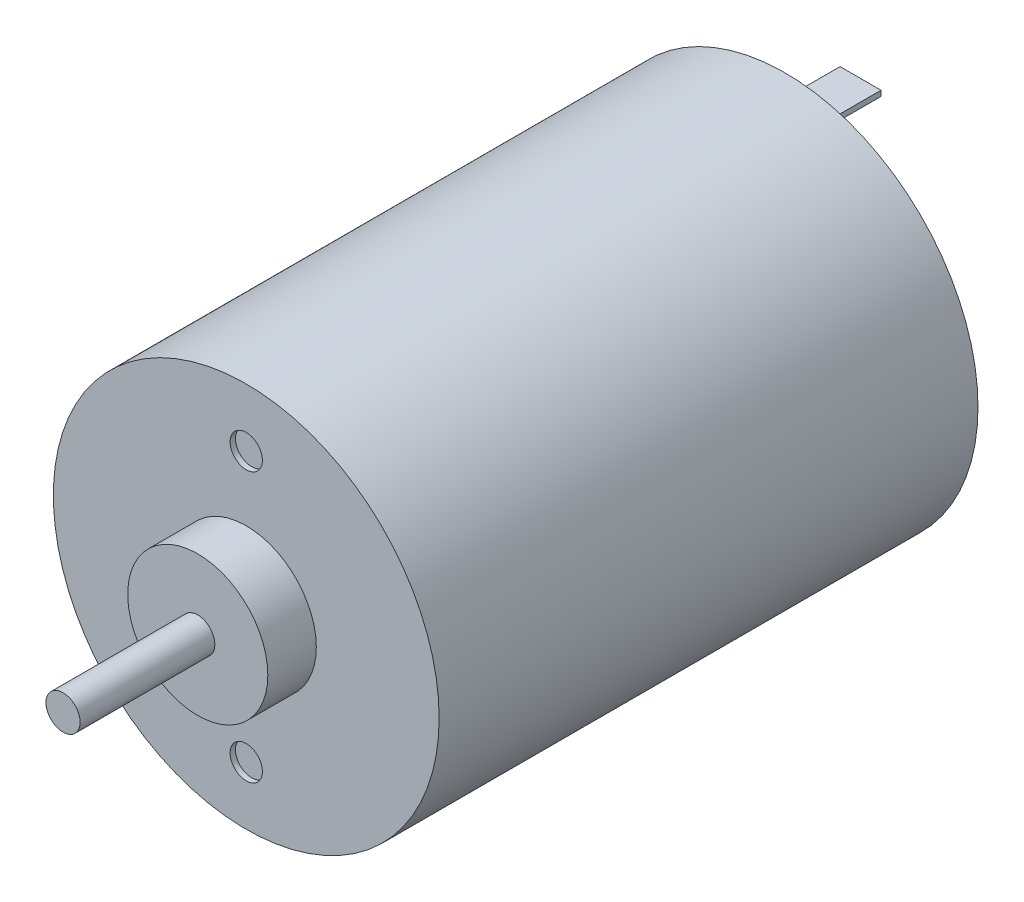
ISO-10303-21;
HEADER;
FILE_DESCRIPTION(('STEP AP214'),'2;1');
FILE_NAME('part.step','',(''),(''),'','','');
FILE_SCHEMA(('AUTOMOTIVE_DESIGN { 1 0 10303 214 1 1 1 1 }'));
ENDSEC;
DATA;
#1=APPLICATION_CONTEXT('core data for automotive mechanical design processes');
#2=APPLICATION_PROTOCOL_DEFINITION('international standard','automotive_design',2000,#1);
#3=PRODUCT_CONTEXT('',#1,'mechanical');
#4=PRODUCT('Part','Part','',(#3));
#5=PRODUCT_RELATED_PRODUCT_CATEGORY('part','',(#4));
#6=PRODUCT_DEFINITION_FORMATION('','',#4);
#7=PRODUCT_DEFINITION_CONTEXT('part definition',#1,'design');
#8=PRODUCT_DEFINITION('design','',#6,#7);
#9=PRODUCT_DEFINITION_SHAPE('','',#8);
#10=(LENGTH_UNIT() NAMED_UNIT(*) SI_UNIT(.MILLI.,.METRE.));
#11=(NAMED_UNIT(*) PLANE_ANGLE_UNIT() SI_UNIT($,.RADIAN.));
#12=(NAMED_UNIT(*) SI_UNIT($,.STERADIAN.) SOLID_ANGLE_UNIT());
#13=UNCERTAINTY_MEASURE_WITH_UNIT(LENGTH_MEASURE(1.E-05),#10,'distance_accuracy_value','');
#14=(GEOMETRIC_REPRESENTATION_CONTEXT(3) GLOBAL_UNCERTAINTY_ASSIGNED_CONTEXT((#13)) GLOBAL_UNIT_ASSIGNED_CONTEXT((#10,
#11,#12)) REPRESENTATION_CONTEXT('',''));
#15=CARTESIAN_POINT('',(0.,0.,0.));
#16=DIRECTION('',(0.,0.,1.));
#17=DIRECTION('',(1.,0.,0.));
#18=AXIS2_PLACEMENT_3D('',#15,#16,#17);
#19=CARTESIAN_POINT('',(0.,0.,0.));
#20=DIRECTION('',(0.,0.,1.));
#21=DIRECTION('',(1.,0.,0.));
#22=AXIS2_PLACEMENT_3D('',#19,#20,#21);
#23=PLANE('',#22);
#24=DIRECTION('',(0.,-1.,0.));
#25=VECTOR('',#24,1.);
#26=CARTESIAN_POINT('',(1.9,13.95,0.));
#27=LINE('',#26,#25);
#28=CARTESIAN_POINT('',(1.9,13.95,0.));
#29=VERTEX_POINT('',#28);
#30=CARTESIAN_POINT('',(1.9,13.45,0.));
#31=VERTEX_POINT('',#30);
#32=EDGE_CURVE('E121',#29,#31,#27,.T.);
#33=ORIENTED_EDGE('',*,*,#32,.F.);
#34=DIRECTION('',(1.,0.,0.));
#35=VECTOR('',#34,1.);
#36=CARTESIAN_POINT('',(1.9,13.95,0.));
#37=LINE('',#36,#35);
#38=CARTESIAN_POINT('',(-1.9,13.95,0.));
#39=VERTEX_POINT('',#38);
#40=EDGE_CURVE('E134',#39,#29,#37,.T.);
#41=ORIENTED_EDGE('',*,*,#40,.F.);
#42=DIRECTION('',(0.,1.,0.));
#43=VECTOR('',#42,1.);
#44=CARTESIAN_POINT('',(-1.9,13.95,0.));
#45=LINE('',#44,#43);
#46=CARTESIAN_POINT('',(-1.9,13.45,0.));
#47=VERTEX_POINT('',#46);
#48=EDGE_CURVE('E143',#47,#39,#45,.T.);
#49=ORIENTED_EDGE('',*,*,#48,.F.);
#50=DIRECTION('',(-1.,0.,0.));
#51=VECTOR('',#50,1.);
#52=CARTESIAN_POINT('',(1.9,13.45,0.));
#53=LINE('',#52,#51);
#54=EDGE_CURVE('E124',#31,#47,#53,.T.);
#55=ORIENTED_EDGE('',*,*,#54,.F.);
#56=EDGE_LOOP('',(#33,#41,#49,#55));
#57=FACE_BOUND('',#56,.T.);
#58=CARTESIAN_POINT('',(0.,0.,0.));
#59=DIRECTION('',(0.,0.,1.));
#60=DIRECTION('',(1.,0.,0.));
#61=AXIS2_PLACEMENT_3D('',#58,#59,#60);
#62=CIRCLE('',#61,17.9);
#63=CARTESIAN_POINT('',(17.9,0.,0.));
#64=VERTEX_POINT('',#63);
#65=EDGE_CURVE('E37',#64,#64,#62,.T.);
#66=ORIENTED_EDGE('',*,*,#65,.F.);
#67=EDGE_LOOP('',(#66));
#68=FACE_BOUND('',#67,.T.);
#69=DIRECTION('',(0.,-1.,0.));
#70=VECTOR('',#69,1.);
#71=CARTESIAN_POINT('',(1.9,-13.95,0.));
#72=LINE('',#71,#70);
#73=CARTESIAN_POINT('',(1.9,-13.45,0.));
#74=VERTEX_POINT('',#73);
#75=CARTESIAN_POINT('',(1.9,-13.95,0.));
#76=VERTEX_POINT('',#75);
#77=EDGE_CURVE('E120',#74,#76,#72,.T.);
#78=ORIENTED_EDGE('',*,*,#77,.F.);
#79=DIRECTION('',(1.,0.,0.));
#80=VECTOR('',#79,1.);
#81=CARTESIAN_POINT('',(1.9,-13.45,0.));
#82=LINE('',#81,#80);
#83=CARTESIAN_POINT('',(-1.9,-13.45,0.));
#84=VERTEX_POINT('',#83);
#85=EDGE_CURVE('E117',#84,#74,#82,.T.);
#86=ORIENTED_EDGE('',*,*,#85,.F.);
#87=DIRECTION('',(0.,1.,0.));
#88=VECTOR('',#87,1.);
#89=CARTESIAN_POINT('',(-1.9,-13.95,0.));
#90=LINE('',#89,#88);
#91=CARTESIAN_POINT('',(-1.9,-13.95,0.));
#92=VERTEX_POINT('',#91);
#93=EDGE_CURVE('E55',#92,#84,#90,.T.);
#94=ORIENTED_EDGE('',*,*,#93,.F.);
#95=DIRECTION('',(-1.,0.,0.));
#96=VECTOR('',#95,1.);
#97=CARTESIAN_POINT('',(1.9,-13.95,0.));
#98=LINE('',#97,#96);
#99=EDGE_CURVE('E50',#76,#92,#98,.T.);
#100=ORIENTED_EDGE('',*,*,#99,.F.);
#101=EDGE_LOOP('',(#78,#86,#94,#100));
#102=FACE_BOUND('',#101,.T.);
#103=ADVANCED_FACE('F33',(#57,#68,#102),#23,.F.);
#104=CARTESIAN_POINT('',(0.,0.,50.));
#105=DIRECTION('',(0.,0.,-1.));
#106=DIRECTION('',(-1.,0.,0.));
#107=AXIS2_PLACEMENT_3D('',#104,#105,#106);
#108=CYLINDRICAL_SURFACE('',#107,17.9);
#109=CARTESIAN_POINT('',(0.,0.,50.));
#110=DIRECTION('',(0.,0.,1.));
#111=DIRECTION('',(1.,0.,0.));
#112=AXIS2_PLACEMENT_3D('',#109,#110,#111);
#113=CIRCLE('',#112,17.9);
#114=CARTESIAN_POINT('',(17.9,0.,50.));
#115=VERTEX_POINT('',#114);
#116=EDGE_CURVE('E178',#115,#115,#113,.T.);
#117=ORIENTED_EDGE('',*,*,#116,.F.);
#118=EDGE_LOOP('',(#117));
#119=FACE_BOUND('',#118,.T.);
#120=ORIENTED_EDGE('',*,*,#65,.T.);
#121=EDGE_LOOP('',(#120));
#122=FACE_BOUND('',#121,.T.);
#123=ADVANCED_FACE('F35',(#119,#122),#108,.T.);
#124=CARTESIAN_POINT('',(0.,0.,50.));
#125=DIRECTION('',(0.,0.,1.));
#126=DIRECTION('',(1.,0.,0.));
#127=AXIS2_PLACEMENT_3D('',#124,#125,#126);
#128=PLANE('',#127);
#129=CARTESIAN_POINT('',(0.,12.5,50.));
#130=DIRECTION('',(0.,0.,1.));
#131=DIRECTION('',(1.,0.,0.));
#132=AXIS2_PLACEMENT_3D('',#129,#130,#131);
#133=CIRCLE('',#132,1.5);
#134=CARTESIAN_POINT('',(1.5,12.5,50.));
#135=VERTEX_POINT('',#134);
#136=EDGE_CURVE('E164',#135,#135,#133,.T.);
#137=ORIENTED_EDGE('',*,*,#136,.F.);
#138=EDGE_LOOP('',(#137));
#139=FACE_BOUND('',#138,.T.);
#140=CARTESIAN_POINT('',(0.,-12.5,50.));
#141=DIRECTION('',(0.,0.,1.));
#142=DIRECTION('',(1.,0.,0.));
#143=AXIS2_PLACEMENT_3D('',#140,#141,#142);
#144=CIRCLE('',#143,1.5);
#145=CARTESIAN_POINT('',(1.5,-12.5,50.));
#146=VERTEX_POINT('',#145);
#147=EDGE_CURVE('E159',#146,#146,#144,.T.);
#148=ORIENTED_EDGE('',*,*,#147,.F.);
#149=EDGE_LOOP('',(#148));
#150=FACE_BOUND('',#149,.T.);
#151=CARTESIAN_POINT('',(0.,0.,50.));
#152=DIRECTION('',(0.,0.,1.));
#153=DIRECTION('',(1.,0.,0.));
#154=AXIS2_PLACEMENT_3D('',#151,#152,#153);
#155=CIRCLE('',#154,6.5);
#156=CARTESIAN_POINT('',(6.5,0.,50.));
#157=VERTEX_POINT('',#156);
#158=EDGE_CURVE('E42',#157,#157,#155,.T.);
#159=ORIENTED_EDGE('',*,*,#158,.F.);
#160=EDGE_LOOP('',(#159));
#161=FACE_BOUND('',#160,.T.);
#162=ORIENTED_EDGE('',*,*,#116,.T.);
#163=EDGE_LOOP('',(#162));
#164=FACE_BOUND('',#163,.T.);
#165=ADVANCED_FACE('F266',(#139,#150,#161,#164),#128,.T.);
#166=CARTESIAN_POINT('',(0.,0.,54.5));
#167=DIRECTION('',(0.,0.,-1.));
#168=DIRECTION('',(-1.,0.,0.));
#169=AXIS2_PLACEMENT_3D('',#166,#167,#168);
#170=CYLINDRICAL_SURFACE('',#169,6.5);
#171=CARTESIAN_POINT('',(0.,0.,54.5));
#172=DIRECTION('',(0.,0.,1.));
#173=DIRECTION('',(1.,0.,0.));
#174=AXIS2_PLACEMENT_3D('',#171,#172,#173);
#175=CIRCLE('',#174,6.5);
#176=CARTESIAN_POINT('',(6.5,0.,54.5));
#177=VERTEX_POINT('',#176);
#178=EDGE_CURVE('E173',#177,#177,#175,.T.);
#179=ORIENTED_EDGE('',*,*,#178,.F.);
#180=EDGE_LOOP('',(#179));
#181=FACE_BOUND('',#180,.T.);
#182=ORIENTED_EDGE('',*,*,#158,.T.);
#183=EDGE_LOOP('',(#182));
#184=FACE_BOUND('',#183,.T.);
#185=ADVANCED_FACE('F262',(#181,#184),#170,.T.);
#186=CARTESIAN_POINT('',(0.,0.,54.5));
#187=DIRECTION('',(0.,0.,1.));
#188=DIRECTION('',(1.,0.,0.));
#189=AXIS2_PLACEMENT_3D('',#186,#187,#188);
#190=PLANE('',#189);
#191=CARTESIAN_POINT('',(0.,0.,54.5));
#192=DIRECTION('',(0.,0.,1.));
#193=DIRECTION('',(1.,0.,0.));
#194=AXIS2_PLACEMENT_3D('',#191,#192,#193);
#195=CIRCLE('',#194,1.585);
#196=CARTESIAN_POINT('',(1.585,0.,54.5));
#197=VERTEX_POINT('',#196);
#198=EDGE_CURVE('E11',#197,#197,#195,.T.);
#199=ORIENTED_EDGE('',*,*,#198,.F.);
#200=EDGE_LOOP('',(#199));
#201=FACE_BOUND('',#200,.T.);
#202=ORIENTED_EDGE('',*,*,#178,.T.);
#203=EDGE_LOOP('',(#202));
#204=FACE_BOUND('',#203,.T.);
#205=ADVANCED_FACE('F258',(#201,#204),#190,.T.);
#206=CARTESIAN_POINT('',(0.,0.,67.));
#207=DIRECTION('',(0.,0.,-1.));
#208=DIRECTION('',(-1.,0.,0.));
#209=AXIS2_PLACEMENT_3D('',#206,#207,#208);
#210=CYLINDRICAL_SURFACE('',#209,1.585);
#211=CARTESIAN_POINT('',(0.,0.,67.));
#212=DIRECTION('',(0.,0.,1.));
#213=DIRECTION('',(1.,0.,0.));
#214=AXIS2_PLACEMENT_3D('',#211,#212,#213);
#215=CIRCLE('',#214,1.585);
#216=CARTESIAN_POINT('',(1.585,0.,67.));
#217=VERTEX_POINT('',#216);
#218=EDGE_CURVE('E163',#217,#217,#215,.T.);
#219=ORIENTED_EDGE('',*,*,#218,.F.);
#220=EDGE_LOOP('',(#219));
#221=FACE_BOUND('',#220,.T.);
#222=ORIENTED_EDGE('',*,*,#198,.T.);
#223=EDGE_LOOP('',(#222));
#224=FACE_BOUND('',#223,.T.);
#225=ADVANCED_FACE('F254',(#221,#224),#210,.T.);
#226=CARTESIAN_POINT('',(0.,0.,67.));
#227=DIRECTION('',(0.,0.,1.));
#228=DIRECTION('',(1.,0.,0.));
#229=AXIS2_PLACEMENT_3D('',#226,#227,#228);
#230=PLANE('',#229);
#231=ORIENTED_EDGE('',*,*,#218,.T.);
#232=EDGE_LOOP('',(#231));
#233=FACE_BOUND('',#232,.T.);
#234=ADVANCED_FACE('F250',(#233),#230,.T.);
#235=CARTESIAN_POINT('',(0.,-12.5,49.5));
#236=DIRECTION('',(0.,0.,1.));
#237=DIRECTION('',(1.,0.,0.));
#238=AXIS2_PLACEMENT_3D('',#235,#236,#237);
#239=CYLINDRICAL_SURFACE('',#238,1.5);
#240=CARTESIAN_POINT('',(0.,-12.5,49.5));
#241=DIRECTION('',(0.,0.,1.));
#242=DIRECTION('',(1.,0.,0.));
#243=AXIS2_PLACEMENT_3D('',#240,#241,#242);
#244=CIRCLE('',#243,1.5);
#245=CARTESIAN_POINT('',(1.5,-12.5,49.5));
#246=VERTEX_POINT('',#245);
#247=EDGE_CURVE('E167',#246,#246,#244,.T.);
#248=ORIENTED_EDGE('',*,*,#247,.F.);
#249=EDGE_LOOP('',(#248));
#250=FACE_BOUND('',#249,.T.);
#251=ORIENTED_EDGE('',*,*,#147,.T.);
#252=EDGE_LOOP('',(#251));
#253=FACE_BOUND('',#252,.T.);
#254=ADVANCED_FACE('F246',(#250,#253),#239,.F.);
#255=CARTESIAN_POINT('',(0.,-12.5,49.5));
#256=DIRECTION('',(0.,0.,1.));
#257=DIRECTION('',(1.,0.,0.));
#258=AXIS2_PLACEMENT_3D('',#255,#256,#257);
#259=PLANE('',#258);
#260=ORIENTED_EDGE('',*,*,#247,.T.);
#261=EDGE_LOOP('',(#260));
#262=FACE_BOUND('',#261,.T.);
#263=ADVANCED_FACE('F242',(#262),#259,.T.);
#264=CARTESIAN_POINT('',(0.,12.5,49.5));
#265=DIRECTION('',(0.,0.,1.));
#266=DIRECTION('',(1.,0.,0.));
#267=AXIS2_PLACEMENT_3D('',#264,#265,#266);
#268=CYLINDRICAL_SURFACE('',#267,1.5);
#269=CARTESIAN_POINT('',(0.,12.5,49.5));
#270=DIRECTION('',(0.,0.,1.));
#271=DIRECTION('',(1.,0.,0.));
#272=AXIS2_PLACEMENT_3D('',#269,#270,#271);
#273=CIRCLE('',#272,1.5);
#274=CARTESIAN_POINT('',(1.5,12.5,49.5));
#275=VERTEX_POINT('',#274);
#276=EDGE_CURVE('E160',#275,#275,#273,.T.);
#277=ORIENTED_EDGE('',*,*,#276,.F.);
#278=EDGE_LOOP('',(#277));
#279=FACE_BOUND('',#278,.T.);
#280=ORIENTED_EDGE('',*,*,#136,.T.);
#281=EDGE_LOOP('',(#280));
#282=FACE_BOUND('',#281,.T.);
#283=ADVANCED_FACE('F238',(#279,#282),#268,.F.);
#284=CARTESIAN_POINT('',(0.,12.5,49.5));
#285=DIRECTION('',(0.,0.,1.));
#286=DIRECTION('',(1.,0.,0.));
#287=AXIS2_PLACEMENT_3D('',#284,#285,#286);
#288=PLANE('',#287);
#289=ORIENTED_EDGE('',*,*,#276,.T.);
#290=EDGE_LOOP('',(#289));
#291=FACE_BOUND('',#290,.T.);
#292=ADVANCED_FACE('F234',(#291),#288,.T.);
#293=CARTESIAN_POINT('',(1.9,13.95,-7.));
#294=DIRECTION('',(-1.,0.,0.));
#295=DIRECTION('',(0.,0.,1.));
#296=AXIS2_PLACEMENT_3D('',#293,#294,#295);
#297=PLANE('',#296);
#298=ORIENTED_EDGE('',*,*,#32,.T.);
#299=DIRECTION('',(0.,0.,1.));
#300=VECTOR('',#299,1.);
#301=CARTESIAN_POINT('',(1.9,13.45,-7.));
#302=LINE('',#301,#300);
#303=CARTESIAN_POINT('',(1.9,13.45,-7.));
#304=VERTEX_POINT('',#303);
#305=EDGE_CURVE('E156',#304,#31,#302,.T.);
#306=ORIENTED_EDGE('',*,*,#305,.F.);
#307=DIRECTION('',(0.,-1.,0.));
#308=VECTOR('',#307,1.);
#309=CARTESIAN_POINT('',(1.9,13.95,-7.));
#310=LINE('',#309,#308);
#311=CARTESIAN_POINT('',(1.9,13.95,-7.));
#312=VERTEX_POINT('',#311);
#313=EDGE_CURVE('E130',#312,#304,#310,.T.);
#314=ORIENTED_EDGE('',*,*,#313,.F.);
#315=DIRECTION('',(0.,0.,1.));
#316=VECTOR('',#315,1.);
#317=CARTESIAN_POINT('',(1.9,13.95,-7.));
#318=LINE('',#317,#316);
#319=EDGE_CURVE('E139',#312,#29,#318,.T.);
#320=ORIENTED_EDGE('',*,*,#319,.T.);
#321=EDGE_LOOP('',(#298,#306,#314,#320));
#322=FACE_BOUND('',#321,.T.);
#323=ADVANCED_FACE('F230',(#322),#297,.F.);
#324=CARTESIAN_POINT('',(1.9,13.45,-7.));
#325=DIRECTION('',(0.,1.,0.));
#326=DIRECTION('',(0.,0.,1.));
#327=AXIS2_PLACEMENT_3D('',#324,#325,#326);
#328=PLANE('',#327);
#329=ORIENTED_EDGE('',*,*,#54,.T.);
#330=DIRECTION('',(0.,0.,1.));
#331=VECTOR('',#330,1.);
#332=CARTESIAN_POINT('',(-1.9,13.45,-7.));
#333=LINE('',#332,#331);
#334=CARTESIAN_POINT('',(-1.9,13.45,-7.));
#335=VERTEX_POINT('',#334);
#336=EDGE_CURVE('E153',#335,#47,#333,.T.);
#337=ORIENTED_EDGE('',*,*,#336,.F.);
#338=DIRECTION('',(-1.,0.,0.));
#339=VECTOR('',#338,1.);
#340=CARTESIAN_POINT('',(1.9,13.45,-7.));
#341=LINE('',#340,#339);
#342=EDGE_CURVE('E133',#304,#335,#341,.T.);
#343=ORIENTED_EDGE('',*,*,#342,.F.);
#344=ORIENTED_EDGE('',*,*,#305,.T.);
#345=EDGE_LOOP('',(#329,#337,#343,#344));
#346=FACE_BOUND('',#345,.T.);
#347=ADVANCED_FACE('F226',(#346),#328,.F.);
#348=CARTESIAN_POINT('',(-1.9,13.95,-7.));
#349=DIRECTION('',(1.,0.,0.));
#350=DIRECTION('',(0.,0.,-1.));
#351=AXIS2_PLACEMENT_3D('',#348,#349,#350);
#352=PLANE('',#351);
#353=ORIENTED_EDGE('',*,*,#48,.T.);
#354=DIRECTION('',(0.,0.,1.));
#355=VECTOR('',#354,1.);
#356=CARTESIAN_POINT('',(-1.9,13.95,-7.));
#357=LINE('',#356,#355);
#358=CARTESIAN_POINT('',(-1.9,13.95,-7.));
#359=VERTEX_POINT('',#358);
#360=EDGE_CURVE('E150',#359,#39,#357,.T.);
#361=ORIENTED_EDGE('',*,*,#360,.F.);
#362=DIRECTION('',(0.,1.,0.));
#363=VECTOR('',#362,1.);
#364=CARTESIAN_POINT('',(-1.9,13.95,-7.));
#365=LINE('',#364,#363);
#366=EDGE_CURVE('E136',#335,#359,#365,.T.);
#367=ORIENTED_EDGE('',*,*,#366,.F.);
#368=ORIENTED_EDGE('',*,*,#336,.T.);
#369=EDGE_LOOP('',(#353,#361,#367,#368));
#370=FACE_BOUND('',#369,.T.);
#371=ADVANCED_FACE('F222',(#370),#352,.F.);
#372=CARTESIAN_POINT('',(1.9,13.95,-7.));
#373=DIRECTION('',(0.,-1.,0.));
#374=DIRECTION('',(0.,0.,-1.));
#375=AXIS2_PLACEMENT_3D('',#372,#373,#374);
#376=PLANE('',#375);
#377=ORIENTED_EDGE('',*,*,#40,.T.);
#378=ORIENTED_EDGE('',*,*,#319,.F.);
#379=DIRECTION('',(1.,0.,0.));
#380=VECTOR('',#379,1.);
#381=CARTESIAN_POINT('',(1.9,13.95,-7.));
#382=LINE('',#381,#380);
#383=EDGE_CURVE('E138',#359,#312,#382,.T.);
#384=ORIENTED_EDGE('',*,*,#383,.F.);
#385=ORIENTED_EDGE('',*,*,#360,.T.);
#386=EDGE_LOOP('',(#377,#378,#384,#385));
#387=FACE_BOUND('',#386,.T.);
#388=ADVANCED_FACE('F218',(#387),#376,.F.);
#389=CARTESIAN_POINT('',(0.,0.,-7.));
#390=DIRECTION('',(0.,0.,-1.));
#391=DIRECTION('',(-1.,0.,0.));
#392=AXIS2_PLACEMENT_3D('',#389,#390,#391);
#393=PLANE('',#392);
#394=ORIENTED_EDGE('',*,*,#313,.T.);
#395=ORIENTED_EDGE('',*,*,#342,.T.);
#396=ORIENTED_EDGE('',*,*,#366,.T.);
#397=ORIENTED_EDGE('',*,*,#383,.T.);
#398=EDGE_LOOP('',(#394,#395,#396,#397));
#399=FACE_BOUND('',#398,.T.);
#400=ADVANCED_FACE('F215',(#399),#393,.T.);
#401=CARTESIAN_POINT('',(1.9,-13.95,-7.));
#402=DIRECTION('',(-1.,0.,0.));
#403=DIRECTION('',(0.,0.,1.));
#404=AXIS2_PLACEMENT_3D('',#401,#402,#403);
#405=PLANE('',#404);
#406=ORIENTED_EDGE('',*,*,#77,.T.);
#407=DIRECTION('',(0.,0.,1.));
#408=VECTOR('',#407,1.);
#409=CARTESIAN_POINT('',(1.9,-13.95,-7.));
#410=LINE('',#409,#408);
#411=CARTESIAN_POINT('',(1.9,-13.95,-7.));
#412=VERTEX_POINT('',#411);
#413=EDGE_CURVE('E101',#412,#76,#410,.T.);
#414=ORIENTED_EDGE('',*,*,#413,.F.);
#415=DIRECTION('',(0.,-1.,0.));
#416=VECTOR('',#415,1.);
#417=CARTESIAN_POINT('',(1.9,-13.95,-7.));
#418=LINE('',#417,#416);
#419=CARTESIAN_POINT('',(1.9,-13.45,-7.));
#420=VERTEX_POINT('',#419);
#421=EDGE_CURVE('E108',#420,#412,#418,.T.);
#422=ORIENTED_EDGE('',*,*,#421,.F.);
#423=DIRECTION('',(0.,0.,1.));
#424=VECTOR('',#423,1.);
#425=CARTESIAN_POINT('',(1.9,-13.45,-7.));
#426=LINE('',#425,#424);
#427=EDGE_CURVE('E193',#420,#74,#426,.T.);
#428=ORIENTED_EDGE('',*,*,#427,.T.);
#429=EDGE_LOOP('',(#406,#414,#422,#428));
#430=FACE_BOUND('',#429,.T.);
#431=ADVANCED_FACE('F119',(#430),#405,.F.);
#432=CARTESIAN_POINT('',(1.9,-13.95,-7.));
#433=DIRECTION('',(0.,1.,0.));
#434=DIRECTION('',(0.,0.,1.));
#435=AXIS2_PLACEMENT_3D('',#432,#433,#434);
#436=PLANE('',#435);
#437=ORIENTED_EDGE('',*,*,#99,.T.);
#438=DIRECTION('',(0.,0.,1.));
#439=VECTOR('',#438,1.);
#440=CARTESIAN_POINT('',(-1.9,-13.95,-7.));
#441=LINE('',#440,#439);
#442=CARTESIAN_POINT('',(-1.9,-13.95,-7.));
#443=VERTEX_POINT('',#442);
#444=EDGE_CURVE('E104',#443,#92,#441,.T.);
#445=ORIENTED_EDGE('',*,*,#444,.F.);
#446=DIRECTION('',(-1.,0.,0.));
#447=VECTOR('',#446,1.);
#448=CARTESIAN_POINT('',(1.9,-13.95,-7.));
#449=LINE('',#448,#447);
#450=EDGE_CURVE('E97',#412,#443,#449,.T.);
#451=ORIENTED_EDGE('',*,*,#450,.F.);
#452=ORIENTED_EDGE('',*,*,#413,.T.);
#453=EDGE_LOOP('',(#437,#445,#451,#452));
#454=FACE_BOUND('',#453,.T.);
#455=ADVANCED_FACE('F99',(#454),#436,.F.);
#456=CARTESIAN_POINT('',(-1.9,-13.95,-7.));
#457=DIRECTION('',(1.,0.,0.));
#458=DIRECTION('',(0.,0.,-1.));
#459=AXIS2_PLACEMENT_3D('',#456,#457,#458);
#460=PLANE('',#459);
#461=ORIENTED_EDGE('',*,*,#93,.T.);
#462=DIRECTION('',(0.,0.,1.));
#463=VECTOR('',#462,1.);
#464=CARTESIAN_POINT('',(-1.9,-13.45,-7.));
#465=LINE('',#464,#463);
#466=CARTESIAN_POINT('',(-1.9,-13.45,-7.));
#467=VERTEX_POINT('',#466);
#468=EDGE_CURVE('E126',#467,#84,#465,.T.);
#469=ORIENTED_EDGE('',*,*,#468,.F.);
#470=DIRECTION('',(0.,1.,0.));
#471=VECTOR('',#470,1.);
#472=CARTESIAN_POINT('',(-1.9,-13.95,-7.));
#473=LINE('',#472,#471);
#474=EDGE_CURVE('E107',#443,#467,#473,.T.);
#475=ORIENTED_EDGE('',*,*,#474,.F.);
#476=ORIENTED_EDGE('',*,*,#444,.T.);
#477=EDGE_LOOP('',(#461,#469,#475,#476));
#478=FACE_BOUND('',#477,.T.);
#479=ADVANCED_FACE('F202',(#478),#460,.F.);
#480=CARTESIAN_POINT('',(1.9,-13.45,-7.));
#481=DIRECTION('',(0.,-1.,0.));
#482=DIRECTION('',(0.,0.,-1.));
#483=AXIS2_PLACEMENT_3D('',#480,#481,#482);
#484=PLANE('',#483);
#485=ORIENTED_EDGE('',*,*,#85,.T.);
#486=ORIENTED_EDGE('',*,*,#427,.F.);
#487=DIRECTION('',(1.,0.,0.));
#488=VECTOR('',#487,1.);
#489=CARTESIAN_POINT('',(1.9,-13.45,-7.));
#490=LINE('',#489,#488);
#491=EDGE_CURVE('E113',#467,#420,#490,.T.);
#492=ORIENTED_EDGE('',*,*,#491,.F.);
#493=ORIENTED_EDGE('',*,*,#468,.T.);
#494=EDGE_LOOP('',(#485,#486,#492,#493));
#495=FACE_BOUND('',#494,.T.);
#496=ADVANCED_FACE('F192',(#495),#484,.F.);
#497=CARTESIAN_POINT('',(0.,0.,-7.));
#498=DIRECTION('',(0.,0.,1.));
#499=DIRECTION('',(1.,0.,0.));
#500=AXIS2_PLACEMENT_3D('',#497,#498,#499);
#501=PLANE('',#500);
#502=ORIENTED_EDGE('',*,*,#421,.T.);
#503=ORIENTED_EDGE('',*,*,#450,.T.);
#504=ORIENTED_EDGE('',*,*,#474,.T.);
#505=ORIENTED_EDGE('',*,*,#491,.T.);
#506=EDGE_LOOP('',(#502,#503,#504,#505));
#507=FACE_BOUND('',#506,.T.);
#508=ADVANCED_FACE('F111',(#507),#501,.F.);
#509=CLOSED_SHELL('',(#103,#123,#165,#185,#205,#225,#234,#254,#263,#283,#292,#323,#347,#371,
#388,#400,#431,#455,#479,#496,#508));
#510=MANIFOLD_SOLID_BREP('B2',#509);
#511=ADVANCED_BREP_SHAPE_REPRESENTATION('',(#18,#510),#14);
#512=SHAPE_DEFINITION_REPRESENTATION(#9,#511);
ENDSEC;
END-ISO-10303-21;
